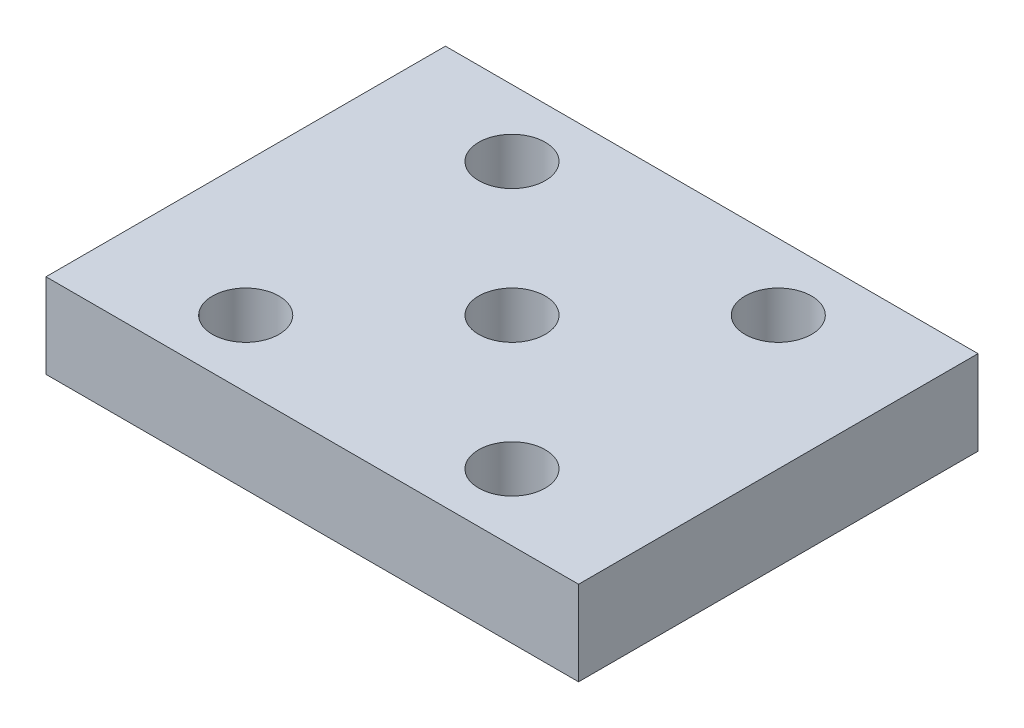
ISO-10303-21;
HEADER;
FILE_DESCRIPTION(('STEP AP214'),'2;1');
FILE_NAME('part.step','',(''),(''),'','','');
FILE_SCHEMA(('AUTOMOTIVE_DESIGN { 1 0 10303 214 1 1 1 1 }'));
ENDSEC;
DATA;
#1=APPLICATION_CONTEXT('core data for automotive mechanical design processes');
#2=APPLICATION_PROTOCOL_DEFINITION('international standard','automotive_design',2000,#1);
#3=PRODUCT_CONTEXT('',#1,'mechanical');
#4=PRODUCT('Part','Part','',(#3));
#5=PRODUCT_RELATED_PRODUCT_CATEGORY('part','',(#4));
#6=PRODUCT_DEFINITION_FORMATION('','',#4);
#7=PRODUCT_DEFINITION_CONTEXT('part definition',#1,'design');
#8=PRODUCT_DEFINITION('design','',#6,#7);
#9=PRODUCT_DEFINITION_SHAPE('','',#8);
#10=(LENGTH_UNIT() NAMED_UNIT(*) SI_UNIT(.MILLI.,.METRE.));
#11=(NAMED_UNIT(*) PLANE_ANGLE_UNIT() SI_UNIT($,.RADIAN.));
#12=(NAMED_UNIT(*) SI_UNIT($,.STERADIAN.) SOLID_ANGLE_UNIT());
#13=UNCERTAINTY_MEASURE_WITH_UNIT(LENGTH_MEASURE(1.E-05),#10,'distance_accuracy_value','');
#14=(GEOMETRIC_REPRESENTATION_CONTEXT(3) GLOBAL_UNCERTAINTY_ASSIGNED_CONTEXT((#13)) GLOBAL_UNIT_ASSIGNED_CONTEXT((#10,
#11,#12)) REPRESENTATION_CONTEXT('',''));
#15=CARTESIAN_POINT('',(0.,0.,0.));
#16=DIRECTION('',(0.,0.,1.));
#17=DIRECTION('',(1.,0.,0.));
#18=AXIS2_PLACEMENT_3D('',#15,#16,#17);
#19=CARTESIAN_POINT('',(0.,3.175,0.));
#20=DIRECTION('',(0.,-1.,0.));
#21=DIRECTION('',(0.,0.,-1.));
#22=AXIS2_PLACEMENT_3D('',#19,#20,#21);
#23=PLANE('',#22);
#24=DIRECTION('',(0.,0.,-1.));
#25=VECTOR('',#24,1.);
#26=CARTESIAN_POINT('',(20.,3.175,15.));
#27=LINE('',#26,#25);
#28=CARTESIAN_POINT('',(20.,3.175,15.));
#29=VERTEX_POINT('',#28);
#30=CARTESIAN_POINT('',(20.,3.175,-15.));
#31=VERTEX_POINT('',#30);
#32=EDGE_CURVE('E85',#29,#31,#27,.T.);
#33=ORIENTED_EDGE('',*,*,#32,.T.);
#34=DIRECTION('',(-1.,0.,0.));
#35=VECTOR('',#34,1.);
#36=CARTESIAN_POINT('',(-20.,3.175,-15.));
#37=LINE('',#36,#35);
#38=CARTESIAN_POINT('',(-20.,3.175,-15.));
#39=VERTEX_POINT('',#38);
#40=EDGE_CURVE('E80',#31,#39,#37,.T.);
#41=ORIENTED_EDGE('',*,*,#40,.T.);
#42=DIRECTION('',(0.,0.,1.));
#43=VECTOR('',#42,1.);
#44=CARTESIAN_POINT('',(-20.,3.175,15.));
#45=LINE('',#44,#43);
#46=CARTESIAN_POINT('',(-20.,3.175,15.));
#47=VERTEX_POINT('',#46);
#48=EDGE_CURVE('E83',#39,#47,#45,.T.);
#49=ORIENTED_EDGE('',*,*,#48,.T.);
#50=DIRECTION('',(1.,0.,0.));
#51=VECTOR('',#50,1.);
#52=CARTESIAN_POINT('',(-20.,3.175,15.));
#53=LINE('',#52,#51);
#54=EDGE_CURVE('E50',#47,#29,#53,.T.);
#55=ORIENTED_EDGE('',*,*,#54,.T.);
#56=EDGE_LOOP('',(#33,#41,#49,#55));
#57=FACE_BOUND('',#56,.T.);
#58=CARTESIAN_POINT('',(0.,3.175,0.));
#59=DIRECTION('',(0.,1.,0.));
#60=DIRECTION('',(0.,0.,1.));
#61=AXIS2_PLACEMENT_3D('',#58,#59,#60);
#62=CIRCLE('',#61,2.5);
#63=CARTESIAN_POINT('',(0.,3.175,2.5));
#64=VERTEX_POINT('',#63);
#65=EDGE_CURVE('E100',#64,#64,#62,.T.);
#66=ORIENTED_EDGE('',*,*,#65,.F.);
#67=EDGE_LOOP('',(#66));
#68=FACE_BOUND('',#67,.T.);
#69=CARTESIAN_POINT('',(-10.,3.175,-10.));
#70=DIRECTION('',(0.,1.,0.));
#71=DIRECTION('',(0.,0.,1.));
#72=AXIS2_PLACEMENT_3D('',#69,#70,#71);
#73=CIRCLE('',#72,2.5);
#74=CARTESIAN_POINT('',(-10.,3.175,-7.5));
#75=VERTEX_POINT('',#74);
#76=EDGE_CURVE('E115',#75,#75,#73,.T.);
#77=ORIENTED_EDGE('',*,*,#76,.F.);
#78=EDGE_LOOP('',(#77));
#79=FACE_BOUND('',#78,.T.);
#80=CARTESIAN_POINT('',(10.,3.175,-10.));
#81=DIRECTION('',(0.,1.,0.));
#82=DIRECTION('',(0.,0.,1.));
#83=AXIS2_PLACEMENT_3D('',#80,#81,#82);
#84=CIRCLE('',#83,2.5);
#85=CARTESIAN_POINT('',(10.,3.175,-7.5));
#86=VERTEX_POINT('',#85);
#87=EDGE_CURVE('E121',#86,#86,#84,.T.);
#88=ORIENTED_EDGE('',*,*,#87,.F.);
#89=EDGE_LOOP('',(#88));
#90=FACE_BOUND('',#89,.T.);
#91=CARTESIAN_POINT('',(10.,3.175,10.));
#92=DIRECTION('',(0.,1.,0.));
#93=DIRECTION('',(0.,0.,1.));
#94=AXIS2_PLACEMENT_3D('',#91,#92,#93);
#95=CIRCLE('',#94,2.5);
#96=CARTESIAN_POINT('',(10.,3.175,12.5));
#97=VERTEX_POINT('',#96);
#98=EDGE_CURVE('E127',#97,#97,#95,.T.);
#99=ORIENTED_EDGE('',*,*,#98,.F.);
#100=EDGE_LOOP('',(#99));
#101=FACE_BOUND('',#100,.T.);
#102=CARTESIAN_POINT('',(-10.,3.175,10.));
#103=DIRECTION('',(0.,1.,0.));
#104=DIRECTION('',(0.,0.,1.));
#105=AXIS2_PLACEMENT_3D('',#102,#103,#104);
#106=CIRCLE('',#105,2.5);
#107=CARTESIAN_POINT('',(-10.,3.175,12.5));
#108=VERTEX_POINT('',#107);
#109=EDGE_CURVE('E133',#108,#108,#106,.T.);
#110=ORIENTED_EDGE('',*,*,#109,.F.);
#111=EDGE_LOOP('',(#110));
#112=FACE_BOUND('',#111,.T.);
#113=ADVANCED_FACE('F33',(#57,#68,#79,#90,#101,#112),#23,.F.);
#114=CARTESIAN_POINT('',(0.,-3.175,0.));
#115=DIRECTION('',(0.,-1.,0.));
#116=DIRECTION('',(0.,0.,-1.));
#117=AXIS2_PLACEMENT_3D('',#114,#115,#116);
#118=PLANE('',#117);
#119=CARTESIAN_POINT('',(10.,-3.175,10.));
#120=DIRECTION('',(0.,1.,0.));
#121=DIRECTION('',(0.,0.,1.));
#122=AXIS2_PLACEMENT_3D('',#119,#120,#121);
#123=CIRCLE('',#122,2.5);
#124=CARTESIAN_POINT('',(10.,-3.175,12.5));
#125=VERTEX_POINT('',#124);
#126=EDGE_CURVE('E130',#125,#125,#123,.T.);
#127=ORIENTED_EDGE('',*,*,#126,.T.);
#128=EDGE_LOOP('',(#127));
#129=FACE_BOUND('',#128,.T.);
#130=CARTESIAN_POINT('',(-10.,-3.175,-10.));
#131=DIRECTION('',(0.,1.,0.));
#132=DIRECTION('',(0.,0.,1.));
#133=AXIS2_PLACEMENT_3D('',#130,#131,#132);
#134=CIRCLE('',#133,2.5);
#135=CARTESIAN_POINT('',(-10.,-3.175,-7.5));
#136=VERTEX_POINT('',#135);
#137=EDGE_CURVE('E118',#136,#136,#134,.T.);
#138=ORIENTED_EDGE('',*,*,#137,.T.);
#139=EDGE_LOOP('',(#138));
#140=FACE_BOUND('',#139,.T.);
#141=DIRECTION('',(0.,0.,-1.));
#142=VECTOR('',#141,1.);
#143=CARTESIAN_POINT('',(20.,-3.175,15.));
#144=LINE('',#143,#142);
#145=CARTESIAN_POINT('',(20.,-3.175,15.));
#146=VERTEX_POINT('',#145);
#147=CARTESIAN_POINT('',(20.,-3.175,-15.));
#148=VERTEX_POINT('',#147);
#149=EDGE_CURVE('E97',#146,#148,#144,.T.);
#150=ORIENTED_EDGE('',*,*,#149,.F.);
#151=DIRECTION('',(1.,0.,0.));
#152=VECTOR('',#151,1.);
#153=CARTESIAN_POINT('',(-20.,-3.175,15.));
#154=LINE('',#153,#152);
#155=CARTESIAN_POINT('',(-20.,-3.175,15.));
#156=VERTEX_POINT('',#155);
#157=EDGE_CURVE('E73',#156,#146,#154,.T.);
#158=ORIENTED_EDGE('',*,*,#157,.F.);
#159=DIRECTION('',(0.,0.,1.));
#160=VECTOR('',#159,1.);
#161=CARTESIAN_POINT('',(-20.,-3.175,15.));
#162=LINE('',#161,#160);
#163=CARTESIAN_POINT('',(-20.,-3.175,-15.));
#164=VERTEX_POINT('',#163);
#165=EDGE_CURVE('E67',#164,#156,#162,.T.);
#166=ORIENTED_EDGE('',*,*,#165,.F.);
#167=DIRECTION('',(-1.,0.,0.));
#168=VECTOR('',#167,1.);
#169=CARTESIAN_POINT('',(-20.,-3.175,-15.));
#170=LINE('',#169,#168);
#171=EDGE_CURVE('E89',#148,#164,#170,.T.);
#172=ORIENTED_EDGE('',*,*,#171,.F.);
#173=EDGE_LOOP('',(#150,#158,#166,#172));
#174=FACE_BOUND('',#173,.T.);
#175=CARTESIAN_POINT('',(0.,-3.175,0.));
#176=DIRECTION('',(0.,1.,0.));
#177=DIRECTION('',(0.,0.,1.));
#178=AXIS2_PLACEMENT_3D('',#175,#176,#177);
#179=CIRCLE('',#178,2.5);
#180=CARTESIAN_POINT('',(0.,-3.175,2.5));
#181=VERTEX_POINT('',#180);
#182=EDGE_CURVE('E112',#181,#181,#179,.T.);
#183=ORIENTED_EDGE('',*,*,#182,.T.);
#184=EDGE_LOOP('',(#183));
#185=FACE_BOUND('',#184,.T.);
#186=CARTESIAN_POINT('',(10.,-3.175,-10.));
#187=DIRECTION('',(0.,1.,0.));
#188=DIRECTION('',(0.,0.,1.));
#189=AXIS2_PLACEMENT_3D('',#186,#187,#188);
#190=CIRCLE('',#189,2.5);
#191=CARTESIAN_POINT('',(10.,-3.175,-7.5));
#192=VERTEX_POINT('',#191);
#193=EDGE_CURVE('E124',#192,#192,#190,.T.);
#194=ORIENTED_EDGE('',*,*,#193,.T.);
#195=EDGE_LOOP('',(#194));
#196=FACE_BOUND('',#195,.T.);
#197=CARTESIAN_POINT('',(-10.,-3.175,10.));
#198=DIRECTION('',(0.,1.,0.));
#199=DIRECTION('',(0.,0.,1.));
#200=AXIS2_PLACEMENT_3D('',#197,#198,#199);
#201=CIRCLE('',#200,2.5);
#202=CARTESIAN_POINT('',(-10.,-3.175,12.5));
#203=VERTEX_POINT('',#202);
#204=EDGE_CURVE('E136',#203,#203,#201,.T.);
#205=ORIENTED_EDGE('',*,*,#204,.T.);
#206=EDGE_LOOP('',(#205));
#207=FACE_BOUND('',#206,.T.);
#208=ADVANCED_FACE('F108',(#129,#140,#174,#185,#196,#207),#118,.T.);
#209=CARTESIAN_POINT('',(20.,3.175,15.));
#210=DIRECTION('',(-1.,0.,0.));
#211=DIRECTION('',(0.,0.,1.));
#212=AXIS2_PLACEMENT_3D('',#209,#210,#211);
#213=PLANE('',#212);
#214=ORIENTED_EDGE('',*,*,#149,.T.);
#215=DIRECTION('',(0.,-1.,0.));
#216=VECTOR('',#215,1.);
#217=CARTESIAN_POINT('',(20.,3.175,-15.));
#218=LINE('',#217,#216);
#219=EDGE_CURVE('E11',#31,#148,#218,.T.);
#220=ORIENTED_EDGE('',*,*,#219,.F.);
#221=ORIENTED_EDGE('',*,*,#32,.F.);
#222=DIRECTION('',(0.,-1.,0.));
#223=VECTOR('',#222,1.);
#224=CARTESIAN_POINT('',(20.,3.175,15.));
#225=LINE('',#224,#223);
#226=EDGE_CURVE('E93',#29,#146,#225,.T.);
#227=ORIENTED_EDGE('',*,*,#226,.T.);
#228=EDGE_LOOP('',(#214,#220,#221,#227));
#229=FACE_BOUND('',#228,.T.);
#230=ADVANCED_FACE('F35',(#229),#213,.F.);
#231=CARTESIAN_POINT('',(-20.,3.175,-15.));
#232=DIRECTION('',(0.,0.,1.));
#233=DIRECTION('',(1.,0.,0.));
#234=AXIS2_PLACEMENT_3D('',#231,#232,#233);
#235=PLANE('',#234);
#236=ORIENTED_EDGE('',*,*,#171,.T.);
#237=DIRECTION('',(0.,-1.,0.));
#238=VECTOR('',#237,1.);
#239=CARTESIAN_POINT('',(-20.,3.175,-15.));
#240=LINE('',#239,#238);
#241=EDGE_CURVE('E42',#39,#164,#240,.T.);
#242=ORIENTED_EDGE('',*,*,#241,.F.);
#243=ORIENTED_EDGE('',*,*,#40,.F.);
#244=ORIENTED_EDGE('',*,*,#219,.T.);
#245=EDGE_LOOP('',(#236,#242,#243,#244));
#246=FACE_BOUND('',#245,.T.);
#247=ADVANCED_FACE('F88',(#246),#235,.F.);
#248=CARTESIAN_POINT('',(-20.,3.175,15.));
#249=DIRECTION('',(1.,0.,0.));
#250=DIRECTION('',(0.,0.,-1.));
#251=AXIS2_PLACEMENT_3D('',#248,#249,#250);
#252=PLANE('',#251);
#253=ORIENTED_EDGE('',*,*,#165,.T.);
#254=DIRECTION('',(0.,-1.,0.));
#255=VECTOR('',#254,1.);
#256=CARTESIAN_POINT('',(-20.,3.175,15.));
#257=LINE('',#256,#255);
#258=EDGE_CURVE('E90',#47,#156,#257,.T.);
#259=ORIENTED_EDGE('',*,*,#258,.F.);
#260=ORIENTED_EDGE('',*,*,#48,.F.);
#261=ORIENTED_EDGE('',*,*,#241,.T.);
#262=EDGE_LOOP('',(#253,#259,#260,#261));
#263=FACE_BOUND('',#262,.T.);
#264=ADVANCED_FACE('F91',(#263),#252,.F.);
#265=CARTESIAN_POINT('',(-20.,3.175,15.));
#266=DIRECTION('',(0.,0.,-1.));
#267=DIRECTION('',(-1.,0.,0.));
#268=AXIS2_PLACEMENT_3D('',#265,#266,#267);
#269=PLANE('',#268);
#270=ORIENTED_EDGE('',*,*,#157,.T.);
#271=ORIENTED_EDGE('',*,*,#226,.F.);
#272=ORIENTED_EDGE('',*,*,#54,.F.);
#273=ORIENTED_EDGE('',*,*,#258,.T.);
#274=EDGE_LOOP('',(#270,#271,#272,#273));
#275=FACE_BOUND('',#274,.T.);
#276=ADVANCED_FACE('F105',(#275),#269,.F.);
#277=CARTESIAN_POINT('',(0.,3.175,0.));
#278=DIRECTION('',(0.,-1.,0.));
#279=DIRECTION('',(0.,0.,-1.));
#280=AXIS2_PLACEMENT_3D('',#277,#278,#279);
#281=CYLINDRICAL_SURFACE('',#280,2.5);
#282=ORIENTED_EDGE('',*,*,#65,.T.);
#283=EDGE_LOOP('',(#282));
#284=FACE_BOUND('',#283,.T.);
#285=ORIENTED_EDGE('',*,*,#182,.F.);
#286=EDGE_LOOP('',(#285));
#287=FACE_BOUND('',#286,.T.);
#288=ADVANCED_FACE('F153',(#284,#287),#281,.F.);
#289=CARTESIAN_POINT('',(-10.,3.175,-10.));
#290=DIRECTION('',(0.,-1.,0.));
#291=DIRECTION('',(0.,0.,-1.));
#292=AXIS2_PLACEMENT_3D('',#289,#290,#291);
#293=CYLINDRICAL_SURFACE('',#292,2.5);
#294=ORIENTED_EDGE('',*,*,#76,.T.);
#295=EDGE_LOOP('',(#294));
#296=FACE_BOUND('',#295,.T.);
#297=ORIENTED_EDGE('',*,*,#137,.F.);
#298=EDGE_LOOP('',(#297));
#299=FACE_BOUND('',#298,.T.);
#300=ADVANCED_FACE('F199',(#296,#299),#293,.F.);
#301=CARTESIAN_POINT('',(10.,3.175,-10.));
#302=DIRECTION('',(0.,-1.,0.));
#303=DIRECTION('',(0.,0.,-1.));
#304=AXIS2_PLACEMENT_3D('',#301,#302,#303);
#305=CYLINDRICAL_SURFACE('',#304,2.5);
#306=ORIENTED_EDGE('',*,*,#87,.T.);
#307=EDGE_LOOP('',(#306));
#308=FACE_BOUND('',#307,.T.);
#309=ORIENTED_EDGE('',*,*,#193,.F.);
#310=EDGE_LOOP('',(#309));
#311=FACE_BOUND('',#310,.T.);
#312=ADVANCED_FACE('F207',(#308,#311),#305,.F.);
#313=CARTESIAN_POINT('',(10.,3.175,10.));
#314=DIRECTION('',(0.,-1.,0.));
#315=DIRECTION('',(0.,0.,-1.));
#316=AXIS2_PLACEMENT_3D('',#313,#314,#315);
#317=CYLINDRICAL_SURFACE('',#316,2.5);
#318=ORIENTED_EDGE('',*,*,#98,.T.);
#319=EDGE_LOOP('',(#318));
#320=FACE_BOUND('',#319,.T.);
#321=ORIENTED_EDGE('',*,*,#126,.F.);
#322=EDGE_LOOP('',(#321));
#323=FACE_BOUND('',#322,.T.);
#324=ADVANCED_FACE('F215',(#320,#323),#317,.F.);
#325=CARTESIAN_POINT('',(-10.,3.175,10.));
#326=DIRECTION('',(0.,-1.,0.));
#327=DIRECTION('',(0.,0.,-1.));
#328=AXIS2_PLACEMENT_3D('',#325,#326,#327);
#329=CYLINDRICAL_SURFACE('',#328,2.5);
#330=ORIENTED_EDGE('',*,*,#109,.T.);
#331=EDGE_LOOP('',(#330));
#332=FACE_BOUND('',#331,.T.);
#333=ORIENTED_EDGE('',*,*,#204,.F.);
#334=EDGE_LOOP('',(#333));
#335=FACE_BOUND('',#334,.T.);
#336=ADVANCED_FACE('F142',(#332,#335),#329,.F.);
#337=CLOSED_SHELL('',(#113,#208,#230,#247,#264,#276,#288,#300,#312,#324,#336));
#338=MANIFOLD_SOLID_BREP('B2',#337);
#339=ADVANCED_BREP_SHAPE_REPRESENTATION('',(#18,#338),#14);
#340=SHAPE_DEFINITION_REPRESENTATION(#9,#339);
ENDSEC;
END-ISO-10303-21;
